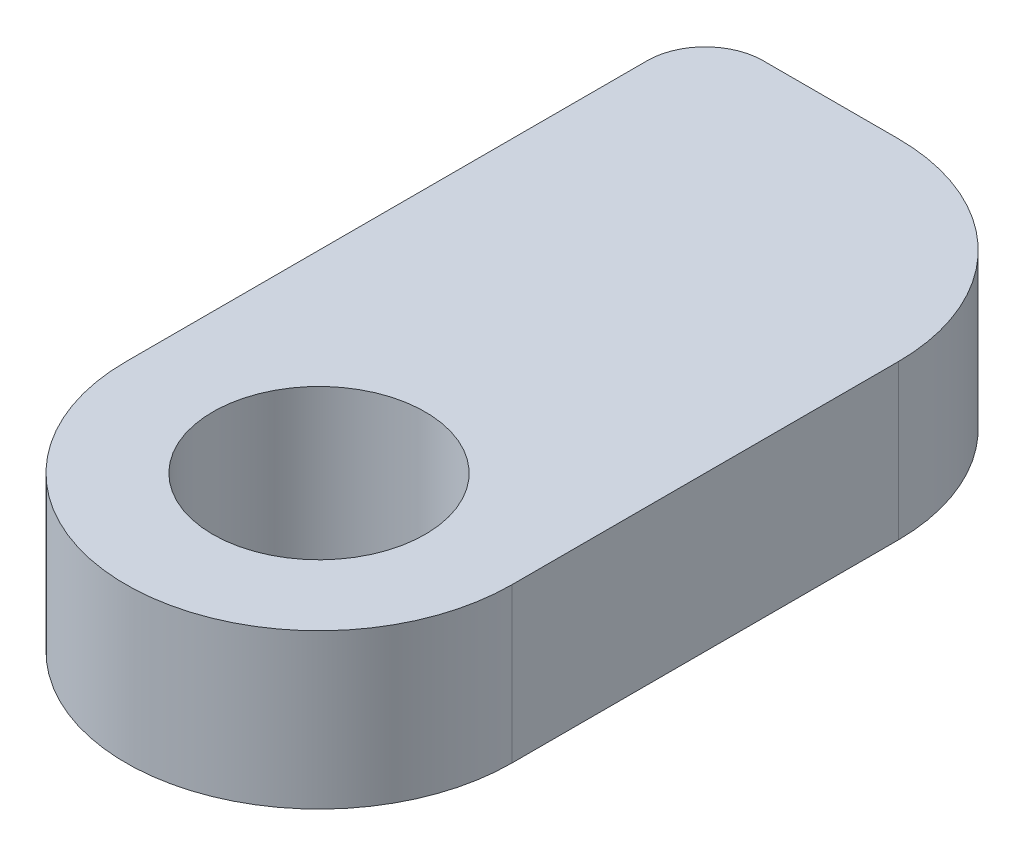
ISO-10303-21;
HEADER;
FILE_DESCRIPTION(('STEP AP214'),'2;1');
FILE_NAME('part.step','',(''),(''),'','','');
FILE_SCHEMA(('AUTOMOTIVE_DESIGN { 1 0 10303 214 1 1 1 1 }'));
ENDSEC;
DATA;
#1=APPLICATION_CONTEXT('core data for automotive mechanical design processes');
#2=APPLICATION_PROTOCOL_DEFINITION('international standard','automotive_design',2000,#1);
#3=PRODUCT_CONTEXT('',#1,'mechanical');
#4=PRODUCT('Part','Part','',(#3));
#5=PRODUCT_RELATED_PRODUCT_CATEGORY('part','',(#4));
#6=PRODUCT_DEFINITION_FORMATION('','',#4);
#7=PRODUCT_DEFINITION_CONTEXT('part definition',#1,'design');
#8=PRODUCT_DEFINITION('design','',#6,#7);
#9=PRODUCT_DEFINITION_SHAPE('','',#8);
#10=(LENGTH_UNIT() NAMED_UNIT(*) SI_UNIT(.MILLI.,.METRE.));
#11=(NAMED_UNIT(*) PLANE_ANGLE_UNIT() SI_UNIT($,.RADIAN.));
#12=(NAMED_UNIT(*) SI_UNIT($,.STERADIAN.) SOLID_ANGLE_UNIT());
#13=UNCERTAINTY_MEASURE_WITH_UNIT(LENGTH_MEASURE(1.E-05),#10,'distance_accuracy_value','');
#14=(GEOMETRIC_REPRESENTATION_CONTEXT(3) GLOBAL_UNCERTAINTY_ASSIGNED_CONTEXT((#13)) GLOBAL_UNIT_ASSIGNED_CONTEXT((#10,
#11,#12)) REPRESENTATION_CONTEXT('',''));
#15=CARTESIAN_POINT('',(0.,0.,0.));
#16=DIRECTION('',(0.,0.,1.));
#17=DIRECTION('',(1.,0.,0.));
#18=AXIS2_PLACEMENT_3D('',#15,#16,#17);
#19=CARTESIAN_POINT('',(0.,8.,10.));
#20=DIRECTION('',(0.,-1.,0.));
#21=DIRECTION('',(0.,0.,-1.));
#22=AXIS2_PLACEMENT_3D('',#19,#20,#21);
#23=CYLINDRICAL_SURFACE('',#22,10.);
#24=DIRECTION('',(0.,-1.,0.));
#25=VECTOR('',#24,1.);
#26=CARTESIAN_POINT('',(10.,8.,10.));
#27=LINE('',#26,#25);
#28=CARTESIAN_POINT('',(10.,8.,10.));
#29=VERTEX_POINT('',#28);
#30=CARTESIAN_POINT('',(10.,0.,10.));
#31=VERTEX_POINT('',#30);
#32=EDGE_CURVE('E89',#29,#31,#27,.T.);
#33=ORIENTED_EDGE('',*,*,#32,.F.);
#34=CARTESIAN_POINT('',(0.,8.,10.));
#35=DIRECTION('',(0.,-1.,0.));
#36=DIRECTION('',(0.,0.,-1.));
#37=AXIS2_PLACEMENT_3D('',#34,#35,#36);
#38=CIRCLE('',#37,10.);
#39=CARTESIAN_POINT('',(-10.,8.,10.));
#40=VERTEX_POINT('',#39);
#41=EDGE_CURVE('E95',#40,#29,#38,.F.);
#42=ORIENTED_EDGE('',*,*,#41,.F.);
#43=DIRECTION('',(0.,-1.,0.));
#44=VECTOR('',#43,1.);
#45=CARTESIAN_POINT('',(-10.,8.,10.));
#46=LINE('',#45,#44);
#47=CARTESIAN_POINT('',(-10.,0.,10.));
#48=VERTEX_POINT('',#47);
#49=EDGE_CURVE('E92',#48,#40,#46,.F.);
#50=ORIENTED_EDGE('',*,*,#49,.F.);
#51=CARTESIAN_POINT('',(0.,0.,10.));
#52=DIRECTION('',(0.,-1.,0.));
#53=DIRECTION('',(0.,0.,-1.));
#54=AXIS2_PLACEMENT_3D('',#51,#52,#53);
#55=CIRCLE('',#54,10.);
#56=EDGE_CURVE('E86',#31,#48,#55,.T.);
#57=ORIENTED_EDGE('',*,*,#56,.F.);
#58=EDGE_LOOP('',(#33,#42,#50,#57));
#59=FACE_BOUND('',#58,.T.);
#60=ADVANCED_FACE('F32',(#59),#23,.T.);
#61=CARTESIAN_POINT('',(0.,8.,0.));
#62=DIRECTION('',(0.,-1.,0.));
#63=DIRECTION('',(0.,0.,-1.));
#64=AXIS2_PLACEMENT_3D('',#61,#62,#63);
#65=PLANE('',#64);
#66=DIRECTION('',(-1.,0.,0.));
#67=VECTOR('',#66,1.);
#68=CARTESIAN_POINT('',(10.,8.,-20.));
#69=LINE('',#68,#67);
#70=CARTESIAN_POINT('',(0.,8.,-20.));
#71=VERTEX_POINT('',#70);
#72=CARTESIAN_POINT('',(-7.,8.,-20.));
#73=VERTEX_POINT('',#72);
#74=EDGE_CURVE('E104',#71,#73,#69,.T.);
#75=ORIENTED_EDGE('',*,*,#74,.T.);
#76=CARTESIAN_POINT('',(-7.,8.,-17.));
#77=DIRECTION('',(0.,-1.,0.));
#78=DIRECTION('',(0.,0.,-1.));
#79=AXIS2_PLACEMENT_3D('',#76,#77,#78);
#80=CIRCLE('',#79,3.);
#81=CARTESIAN_POINT('',(-10.,8.,-17.));
#82=VERTEX_POINT('',#81);
#83=EDGE_CURVE('E11',#73,#82,#80,.F.);
#84=ORIENTED_EDGE('',*,*,#83,.T.);
#85=DIRECTION('',(0.,0.,1.));
#86=VECTOR('',#85,1.);
#87=CARTESIAN_POINT('',(-10.,8.,-20.));
#88=LINE('',#87,#86);
#89=EDGE_CURVE('E112',#82,#40,#88,.T.);
#90=ORIENTED_EDGE('',*,*,#89,.T.);
#91=ORIENTED_EDGE('',*,*,#41,.T.);
#92=DIRECTION('',(0.,0.,-1.));
#93=VECTOR('',#92,1.);
#94=CARTESIAN_POINT('',(10.,8.,-20.));
#95=LINE('',#94,#93);
#96=CARTESIAN_POINT('',(10.,8.,-10.));
#97=VERTEX_POINT('',#96);
#98=EDGE_CURVE('E103',#29,#97,#95,.T.);
#99=ORIENTED_EDGE('',*,*,#98,.T.);
#100=CARTESIAN_POINT('',(0.,8.,-9.99999999999999));
#101=DIRECTION('',(0.,-1.,0.));
#102=DIRECTION('',(0.,0.,-1.));
#103=AXIS2_PLACEMENT_3D('',#100,#101,#102);
#104=CIRCLE('',#103,10.);
#105=EDGE_CURVE('E125',#97,#71,#104,.F.);
#106=ORIENTED_EDGE('',*,*,#105,.T.);
#107=EDGE_LOOP('',(#75,#84,#90,#91,#99,#106));
#108=FACE_BOUND('',#107,.T.);
#109=CARTESIAN_POINT('',(0.,8.,10.));
#110=DIRECTION('',(0.,1.,0.));
#111=DIRECTION('',(0.,0.,1.));
#112=AXIS2_PLACEMENT_3D('',#109,#110,#111);
#113=CIRCLE('',#112,5.5);
#114=CARTESIAN_POINT('',(0.,8.,15.5));
#115=VERTEX_POINT('',#114);
#116=EDGE_CURVE('E114',#115,#115,#113,.T.);
#117=ORIENTED_EDGE('',*,*,#116,.F.);
#118=EDGE_LOOP('',(#117));
#119=FACE_BOUND('',#118,.T.);
#120=ADVANCED_FACE('F137',(#108,#119),#65,.F.);
#121=CARTESIAN_POINT('',(0.,0.,0.));
#122=DIRECTION('',(0.,-1.,0.));
#123=DIRECTION('',(0.,0.,-1.));
#124=AXIS2_PLACEMENT_3D('',#121,#122,#123);
#125=PLANE('',#124);
#126=DIRECTION('',(0.,0.,1.));
#127=VECTOR('',#126,1.);
#128=CARTESIAN_POINT('',(-10.,0.,-20.));
#129=LINE('',#128,#127);
#130=CARTESIAN_POINT('',(-10.,0.,-17.));
#131=VERTEX_POINT('',#130);
#132=EDGE_CURVE('E110',#131,#48,#129,.T.);
#133=ORIENTED_EDGE('',*,*,#132,.F.);
#134=CARTESIAN_POINT('',(-7.,0.,-17.));
#135=DIRECTION('',(0.,-1.,0.));
#136=DIRECTION('',(0.,0.,-1.));
#137=AXIS2_PLACEMENT_3D('',#134,#135,#136);
#138=CIRCLE('',#137,3.);
#139=CARTESIAN_POINT('',(-7.,0.,-20.));
#140=VERTEX_POINT('',#139);
#141=EDGE_CURVE('E54',#131,#140,#138,.T.);
#142=ORIENTED_EDGE('',*,*,#141,.T.);
#143=DIRECTION('',(-1.,0.,0.));
#144=VECTOR('',#143,1.);
#145=CARTESIAN_POINT('',(10.,0.,-20.));
#146=LINE('',#145,#144);
#147=CARTESIAN_POINT('',(0.,0.,-20.));
#148=VERTEX_POINT('',#147);
#149=EDGE_CURVE('E109',#148,#140,#146,.T.);
#150=ORIENTED_EDGE('',*,*,#149,.F.);
#151=CARTESIAN_POINT('',(0.,0.,-9.99999999999999));
#152=DIRECTION('',(0.,-1.,0.));
#153=DIRECTION('',(0.,0.,-1.));
#154=AXIS2_PLACEMENT_3D('',#151,#152,#153);
#155=CIRCLE('',#154,10.);
#156=CARTESIAN_POINT('',(10.,0.,-10.));
#157=VERTEX_POINT('',#156);
#158=EDGE_CURVE('E108',#148,#157,#155,.T.);
#159=ORIENTED_EDGE('',*,*,#158,.T.);
#160=DIRECTION('',(0.,0.,-1.));
#161=VECTOR('',#160,1.);
#162=CARTESIAN_POINT('',(10.,0.,-20.));
#163=LINE('',#162,#161);
#164=EDGE_CURVE('E100',#31,#157,#163,.T.);
#165=ORIENTED_EDGE('',*,*,#164,.F.);
#166=ORIENTED_EDGE('',*,*,#56,.T.);
#167=EDGE_LOOP('',(#133,#142,#150,#159,#165,#166));
#168=FACE_BOUND('',#167,.T.);
#169=CARTESIAN_POINT('',(0.,0.,10.));
#170=DIRECTION('',(0.,1.,0.));
#171=DIRECTION('',(0.,0.,1.));
#172=AXIS2_PLACEMENT_3D('',#169,#170,#171);
#173=CIRCLE('',#172,5.5);
#174=CARTESIAN_POINT('',(0.,0.,15.5));
#175=VERTEX_POINT('',#174);
#176=EDGE_CURVE('E144',#175,#175,#173,.T.);
#177=ORIENTED_EDGE('',*,*,#176,.T.);
#178=EDGE_LOOP('',(#177));
#179=FACE_BOUND('',#178,.T.);
#180=ADVANCED_FACE('F106',(#168,#179),#125,.T.);
#181=CARTESIAN_POINT('',(-10.,8.,-20.));
#182=DIRECTION('',(1.,0.,0.));
#183=DIRECTION('',(0.,0.,-1.));
#184=AXIS2_PLACEMENT_3D('',#181,#182,#183);
#185=PLANE('',#184);
#186=ORIENTED_EDGE('',*,*,#89,.F.);
#187=DIRECTION('',(0.,-1.,0.));
#188=VECTOR('',#187,1.);
#189=CARTESIAN_POINT('',(-10.,8.,-17.));
#190=LINE('',#189,#188);
#191=EDGE_CURVE('E127',#82,#131,#190,.T.);
#192=ORIENTED_EDGE('',*,*,#191,.T.);
#193=ORIENTED_EDGE('',*,*,#132,.T.);
#194=ORIENTED_EDGE('',*,*,#49,.T.);
#195=EDGE_LOOP('',(#186,#192,#193,#194));
#196=FACE_BOUND('',#195,.T.);
#197=ADVANCED_FACE('F133',(#196),#185,.F.);
#198=CARTESIAN_POINT('',(10.,8.,-20.));
#199=DIRECTION('',(-1.,0.,0.));
#200=DIRECTION('',(0.,0.,1.));
#201=AXIS2_PLACEMENT_3D('',#198,#199,#200);
#202=PLANE('',#201);
#203=ORIENTED_EDGE('',*,*,#164,.T.);
#204=DIRECTION('',(0.,-1.,0.));
#205=VECTOR('',#204,1.);
#206=CARTESIAN_POINT('',(10.,8.,-10.));
#207=LINE('',#206,#205);
#208=EDGE_CURVE('E123',#157,#97,#207,.F.);
#209=ORIENTED_EDGE('',*,*,#208,.T.);
#210=ORIENTED_EDGE('',*,*,#98,.F.);
#211=ORIENTED_EDGE('',*,*,#32,.T.);
#212=EDGE_LOOP('',(#203,#209,#210,#211));
#213=FACE_BOUND('',#212,.T.);
#214=ADVANCED_FACE('F99',(#213),#202,.F.);
#215=CARTESIAN_POINT('',(10.,8.,-20.));
#216=DIRECTION('',(0.,0.,1.));
#217=DIRECTION('',(1.,0.,0.));
#218=AXIS2_PLACEMENT_3D('',#215,#216,#217);
#219=PLANE('',#218);
#220=ORIENTED_EDGE('',*,*,#149,.T.);
#221=DIRECTION('',(0.,-1.,0.));
#222=VECTOR('',#221,1.);
#223=CARTESIAN_POINT('',(-7.,8.,-20.));
#224=LINE('',#223,#222);
#225=EDGE_CURVE('E40',#140,#73,#224,.F.);
#226=ORIENTED_EDGE('',*,*,#225,.T.);
#227=ORIENTED_EDGE('',*,*,#74,.F.);
#228=DIRECTION('',(0.,-1.,0.));
#229=VECTOR('',#228,1.);
#230=CARTESIAN_POINT('',(0.,8.,-20.));
#231=LINE('',#230,#229);
#232=EDGE_CURVE('E94',#71,#148,#231,.T.);
#233=ORIENTED_EDGE('',*,*,#232,.T.);
#234=EDGE_LOOP('',(#220,#226,#227,#233));
#235=FACE_BOUND('',#234,.T.);
#236=ADVANCED_FACE('F162',(#235),#219,.F.);
#237=CARTESIAN_POINT('',(0.,8.,10.));
#238=DIRECTION('',(0.,-1.,0.));
#239=DIRECTION('',(0.,0.,-1.));
#240=AXIS2_PLACEMENT_3D('',#237,#238,#239);
#241=CYLINDRICAL_SURFACE('',#240,5.5);
#242=ORIENTED_EDGE('',*,*,#116,.T.);
#243=EDGE_LOOP('',(#242));
#244=FACE_BOUND('',#243,.T.);
#245=ORIENTED_EDGE('',*,*,#176,.F.);
#246=EDGE_LOOP('',(#245));
#247=FACE_BOUND('',#246,.T.);
#248=ADVANCED_FACE('F150',(#244,#247),#241,.F.);
#249=CARTESIAN_POINT('',(0.,8.,-9.99999999999999));
#250=DIRECTION('',(0.,-1.,0.));
#251=DIRECTION('',(0.,0.,-1.));
#252=AXIS2_PLACEMENT_3D('',#249,#250,#251);
#253=CYLINDRICAL_SURFACE('',#252,10.);
#254=ORIENTED_EDGE('',*,*,#105,.F.);
#255=ORIENTED_EDGE('',*,*,#208,.F.);
#256=ORIENTED_EDGE('',*,*,#158,.F.);
#257=ORIENTED_EDGE('',*,*,#232,.F.);
#258=EDGE_LOOP('',(#254,#255,#256,#257));
#259=FACE_BOUND('',#258,.T.);
#260=ADVANCED_FACE('F168',(#259),#253,.T.);
#261=CARTESIAN_POINT('',(-7.,8.,-17.));
#262=DIRECTION('',(0.,-1.,0.));
#263=DIRECTION('',(0.,0.,-1.));
#264=AXIS2_PLACEMENT_3D('',#261,#262,#263);
#265=CYLINDRICAL_SURFACE('',#264,3.);
#266=ORIENTED_EDGE('',*,*,#83,.F.);
#267=ORIENTED_EDGE('',*,*,#225,.F.);
#268=ORIENTED_EDGE('',*,*,#141,.F.);
#269=ORIENTED_EDGE('',*,*,#191,.F.);
#270=EDGE_LOOP('',(#266,#267,#268,#269));
#271=FACE_BOUND('',#270,.T.);
#272=ADVANCED_FACE('F34',(#271),#265,.T.);
#273=CLOSED_SHELL('',(#60,#120,#180,#197,#214,#236,#248,#260,#272));
#274=MANIFOLD_SOLID_BREP('B2',#273);
#275=ADVANCED_BREP_SHAPE_REPRESENTATION('',(#18,#274),#14);
#276=SHAPE_DEFINITION_REPRESENTATION(#9,#275);
ENDSEC;
END-ISO-10303-21;
